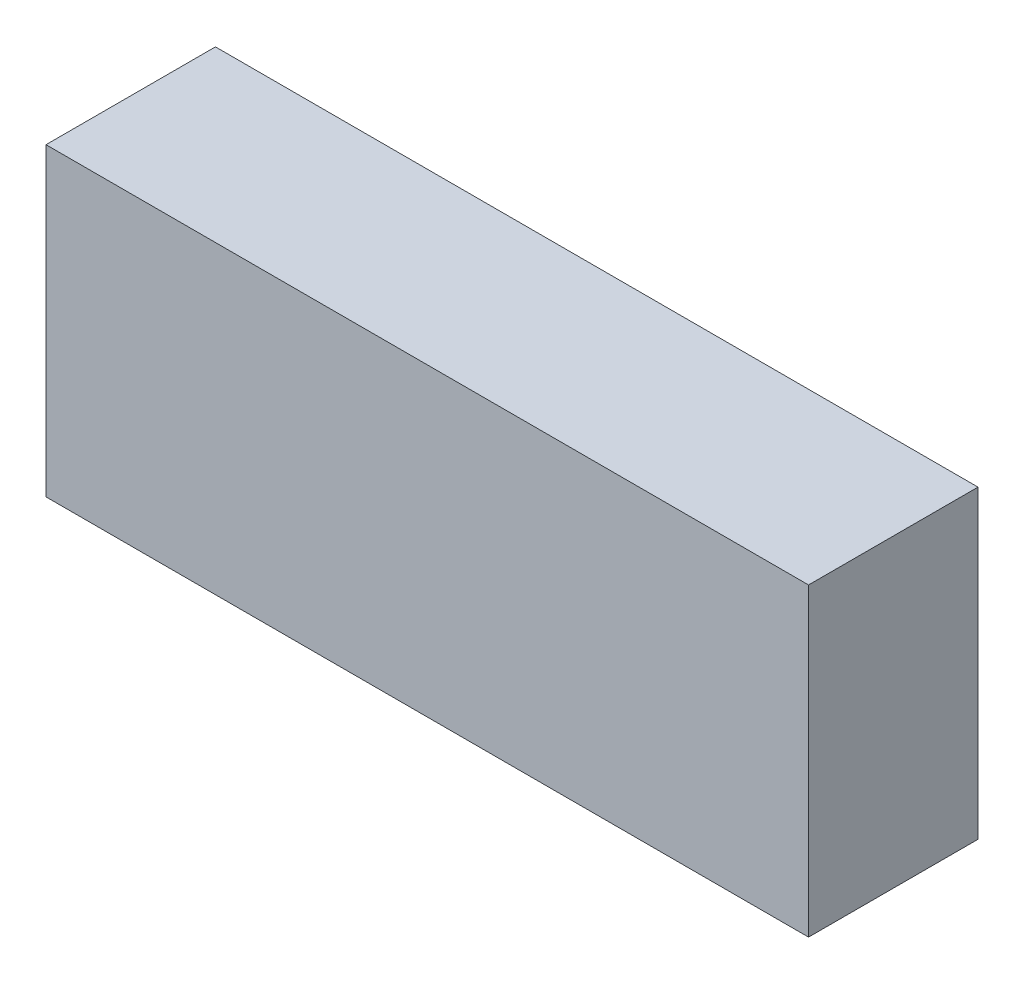
ISO-10303-21;
HEADER;
FILE_DESCRIPTION(('STEP AP214'),'2;1');
FILE_NAME('part.step','',(''),(''),'','','');
FILE_SCHEMA(('AUTOMOTIVE_DESIGN { 1 0 10303 214 1 1 1 1 }'));
ENDSEC;
DATA;
#1=APPLICATION_CONTEXT('core data for automotive mechanical design processes');
#2=APPLICATION_PROTOCOL_DEFINITION('international standard','automotive_design',2000,#1);
#3=PRODUCT_CONTEXT('',#1,'mechanical');
#4=PRODUCT('Part','Part','',(#3));
#5=PRODUCT_RELATED_PRODUCT_CATEGORY('part','',(#4));
#6=PRODUCT_DEFINITION_FORMATION('','',#4);
#7=PRODUCT_DEFINITION_CONTEXT('part definition',#1,'design');
#8=PRODUCT_DEFINITION('design','',#6,#7);
#9=PRODUCT_DEFINITION_SHAPE('','',#8);
#10=(LENGTH_UNIT() NAMED_UNIT(*) SI_UNIT(.MILLI.,.METRE.));
#11=(NAMED_UNIT(*) PLANE_ANGLE_UNIT() SI_UNIT($,.RADIAN.));
#12=(NAMED_UNIT(*) SI_UNIT($,.STERADIAN.) SOLID_ANGLE_UNIT());
#13=UNCERTAINTY_MEASURE_WITH_UNIT(LENGTH_MEASURE(1.E-05),#10,'distance_accuracy_value','');
#14=(GEOMETRIC_REPRESENTATION_CONTEXT(3) GLOBAL_UNCERTAINTY_ASSIGNED_CONTEXT((#13)) GLOBAL_UNIT_ASSIGNED_CONTEXT((#10,
#11,#12)) REPRESENTATION_CONTEXT('',''));
#15=CARTESIAN_POINT('',(0.,0.,0.));
#16=DIRECTION('',(0.,0.,1.));
#17=DIRECTION('',(1.,0.,0.));
#18=AXIS2_PLACEMENT_3D('',#15,#16,#17);
#19=CARTESIAN_POINT('',(-29.2210229276896,27.4368253968254,10.));
#20=DIRECTION('',(1.,0.,0.));
#21=DIRECTION('',(0.,0.,-1.));
#22=AXIS2_PLACEMENT_3D('',#19,#20,#21);
#23=PLANE('',#22);
#24=DIRECTION('',(0.,-1.,0.));
#25=VECTOR('',#24,1.);
#26=CARTESIAN_POINT('',(-29.2210229276896,27.4368253968254,0.));
#27=LINE('',#26,#25);
#28=CARTESIAN_POINT('',(-29.2210229276896,27.4368253968254,0.));
#29=VERTEX_POINT('',#28);
#30=CARTESIAN_POINT('',(-29.2210229276896,9.43682539682541,0.));
#31=VERTEX_POINT('',#30);
#32=EDGE_CURVE('E98',#29,#31,#27,.T.);
#33=ORIENTED_EDGE('',*,*,#32,.T.);
#34=DIRECTION('',(0.,0.,-1.));
#35=VECTOR('',#34,1.);
#36=CARTESIAN_POINT('',(-29.2210229276896,9.43682539682541,10.));
#37=LINE('',#36,#35);
#38=CARTESIAN_POINT('',(-29.2210229276896,9.43682539682541,10.));
#39=VERTEX_POINT('',#38);
#40=EDGE_CURVE('E11',#39,#31,#37,.T.);
#41=ORIENTED_EDGE('',*,*,#40,.F.);
#42=DIRECTION('',(0.,-1.,0.));
#43=VECTOR('',#42,1.);
#44=CARTESIAN_POINT('',(-29.2210229276896,27.4368253968254,10.));
#45=LINE('',#44,#43);
#46=CARTESIAN_POINT('',(-29.2210229276896,27.4368253968254,10.));
#47=VERTEX_POINT('',#46);
#48=EDGE_CURVE('E86',#47,#39,#45,.T.);
#49=ORIENTED_EDGE('',*,*,#48,.F.);
#50=DIRECTION('',(0.,0.,-1.));
#51=VECTOR('',#50,1.);
#52=CARTESIAN_POINT('',(-29.2210229276896,27.4368253968254,10.));
#53=LINE('',#52,#51);
#54=EDGE_CURVE('E94',#47,#29,#53,.T.);
#55=ORIENTED_EDGE('',*,*,#54,.T.);
#56=EDGE_LOOP('',(#33,#41,#49,#55));
#57=FACE_BOUND('',#56,.T.);
#58=ADVANCED_FACE('F35',(#57),#23,.F.);
#59=CARTESIAN_POINT('',(-29.2210229276896,9.43682539682541,10.));
#60=DIRECTION('',(0.,1.,0.));
#61=DIRECTION('',(0.,0.,1.));
#62=AXIS2_PLACEMENT_3D('',#59,#60,#61);
#63=PLANE('',#62);
#64=DIRECTION('',(1.,0.,0.));
#65=VECTOR('',#64,1.);
#66=CARTESIAN_POINT('',(-29.2210229276896,9.43682539682541,0.));
#67=LINE('',#66,#65);
#68=CARTESIAN_POINT('',(15.7789770723104,9.43682539682541,0.));
#69=VERTEX_POINT('',#68);
#70=EDGE_CURVE('E90',#31,#69,#67,.T.);
#71=ORIENTED_EDGE('',*,*,#70,.T.);
#72=DIRECTION('',(0.,0.,-1.));
#73=VECTOR('',#72,1.);
#74=CARTESIAN_POINT('',(15.7789770723104,9.43682539682541,10.));
#75=LINE('',#74,#73);
#76=CARTESIAN_POINT('',(15.7789770723104,9.43682539682541,10.));
#77=VERTEX_POINT('',#76);
#78=EDGE_CURVE('E43',#77,#69,#75,.T.);
#79=ORIENTED_EDGE('',*,*,#78,.F.);
#80=DIRECTION('',(1.,0.,0.));
#81=VECTOR('',#80,1.);
#82=CARTESIAN_POINT('',(-29.2210229276896,9.43682539682541,10.));
#83=LINE('',#82,#81);
#84=EDGE_CURVE('E81',#39,#77,#83,.T.);
#85=ORIENTED_EDGE('',*,*,#84,.F.);
#86=ORIENTED_EDGE('',*,*,#40,.T.);
#87=EDGE_LOOP('',(#71,#79,#85,#86));
#88=FACE_BOUND('',#87,.T.);
#89=ADVANCED_FACE('F89',(#88),#63,.F.);
#90=CARTESIAN_POINT('',(15.7789770723104,27.4368253968254,10.));
#91=DIRECTION('',(-1.,0.,0.));
#92=DIRECTION('',(0.,-1.,0.));
#93=AXIS2_PLACEMENT_3D('',#90,#91,#92);
#94=PLANE('',#93);
#95=DIRECTION('',(0.,1.,0.));
#96=VECTOR('',#95,1.);
#97=CARTESIAN_POINT('',(15.7789770723104,27.4368253968254,0.));
#98=LINE('',#97,#96);
#99=CARTESIAN_POINT('',(15.7789770723104,27.4368253968254,0.));
#100=VERTEX_POINT('',#99);
#101=EDGE_CURVE('E68',#69,#100,#98,.T.);
#102=ORIENTED_EDGE('',*,*,#101,.T.);
#103=DIRECTION('',(0.,0.,-1.));
#104=VECTOR('',#103,1.);
#105=CARTESIAN_POINT('',(15.7789770723104,27.4368253968254,10.));
#106=LINE('',#105,#104);
#107=CARTESIAN_POINT('',(15.7789770723104,27.4368253968254,10.));
#108=VERTEX_POINT('',#107);
#109=EDGE_CURVE('E91',#108,#100,#106,.T.);
#110=ORIENTED_EDGE('',*,*,#109,.F.);
#111=DIRECTION('',(0.,1.,0.));
#112=VECTOR('',#111,1.);
#113=CARTESIAN_POINT('',(15.7789770723104,27.4368253968254,10.));
#114=LINE('',#113,#112);
#115=EDGE_CURVE('E84',#77,#108,#114,.T.);
#116=ORIENTED_EDGE('',*,*,#115,.F.);
#117=ORIENTED_EDGE('',*,*,#78,.T.);
#118=EDGE_LOOP('',(#102,#110,#116,#117));
#119=FACE_BOUND('',#118,.T.);
#120=ADVANCED_FACE('F92',(#119),#94,.F.);
#121=CARTESIAN_POINT('',(-29.2210229276896,27.4368253968254,10.));
#122=DIRECTION('',(0.,-1.,0.));
#123=DIRECTION('',(0.,0.,-1.));
#124=AXIS2_PLACEMENT_3D('',#121,#122,#123);
#125=PLANE('',#124);
#126=DIRECTION('',(-1.,0.,0.));
#127=VECTOR('',#126,1.);
#128=CARTESIAN_POINT('',(-29.2210229276896,27.4368253968254,0.));
#129=LINE('',#128,#127);
#130=EDGE_CURVE('E74',#100,#29,#129,.T.);
#131=ORIENTED_EDGE('',*,*,#130,.T.);
#132=ORIENTED_EDGE('',*,*,#54,.F.);
#133=DIRECTION('',(-1.,0.,0.));
#134=VECTOR('',#133,1.);
#135=CARTESIAN_POINT('',(-29.2210229276896,27.4368253968254,10.));
#136=LINE('',#135,#134);
#137=EDGE_CURVE('E51',#108,#47,#136,.T.);
#138=ORIENTED_EDGE('',*,*,#137,.F.);
#139=ORIENTED_EDGE('',*,*,#109,.T.);
#140=EDGE_LOOP('',(#131,#132,#138,#139));
#141=FACE_BOUND('',#140,.T.);
#142=ADVANCED_FACE('F105',(#141),#125,.F.);
#143=CARTESIAN_POINT('',(0.,0.,10.));
#144=DIRECTION('',(0.,0.,1.));
#145=DIRECTION('',(1.,0.,0.));
#146=AXIS2_PLACEMENT_3D('',#143,#144,#145);
#147=PLANE('',#146);
#148=ORIENTED_EDGE('',*,*,#48,.T.);
#149=ORIENTED_EDGE('',*,*,#84,.T.);
#150=ORIENTED_EDGE('',*,*,#115,.T.);
#151=ORIENTED_EDGE('',*,*,#137,.T.);
#152=EDGE_LOOP('',(#148,#149,#150,#151));
#153=FACE_BOUND('',#152,.T.);
#154=ADVANCED_FACE('F82',(#153),#147,.T.);
#155=CARTESIAN_POINT('',(0.,0.,0.));
#156=DIRECTION('',(0.,0.,1.));
#157=DIRECTION('',(1.,0.,0.));
#158=AXIS2_PLACEMENT_3D('',#155,#156,#157);
#159=PLANE('',#158);
#160=ORIENTED_EDGE('',*,*,#32,.F.);
#161=ORIENTED_EDGE('',*,*,#130,.F.);
#162=ORIENTED_EDGE('',*,*,#101,.F.);
#163=ORIENTED_EDGE('',*,*,#70,.F.);
#164=EDGE_LOOP('',(#160,#161,#162,#163));
#165=FACE_BOUND('',#164,.T.);
#166=ADVANCED_FACE('F108',(#165),#159,.F.);
#167=CLOSED_SHELL('',(#58,#89,#120,#142,#154,#166));
#168=MANIFOLD_SOLID_BREP('B2',#167);
#169=ADVANCED_BREP_SHAPE_REPRESENTATION('',(#18,#168),#14);
#170=SHAPE_DEFINITION_REPRESENTATION(#9,#169);
ENDSEC;
END-ISO-10303-21;
